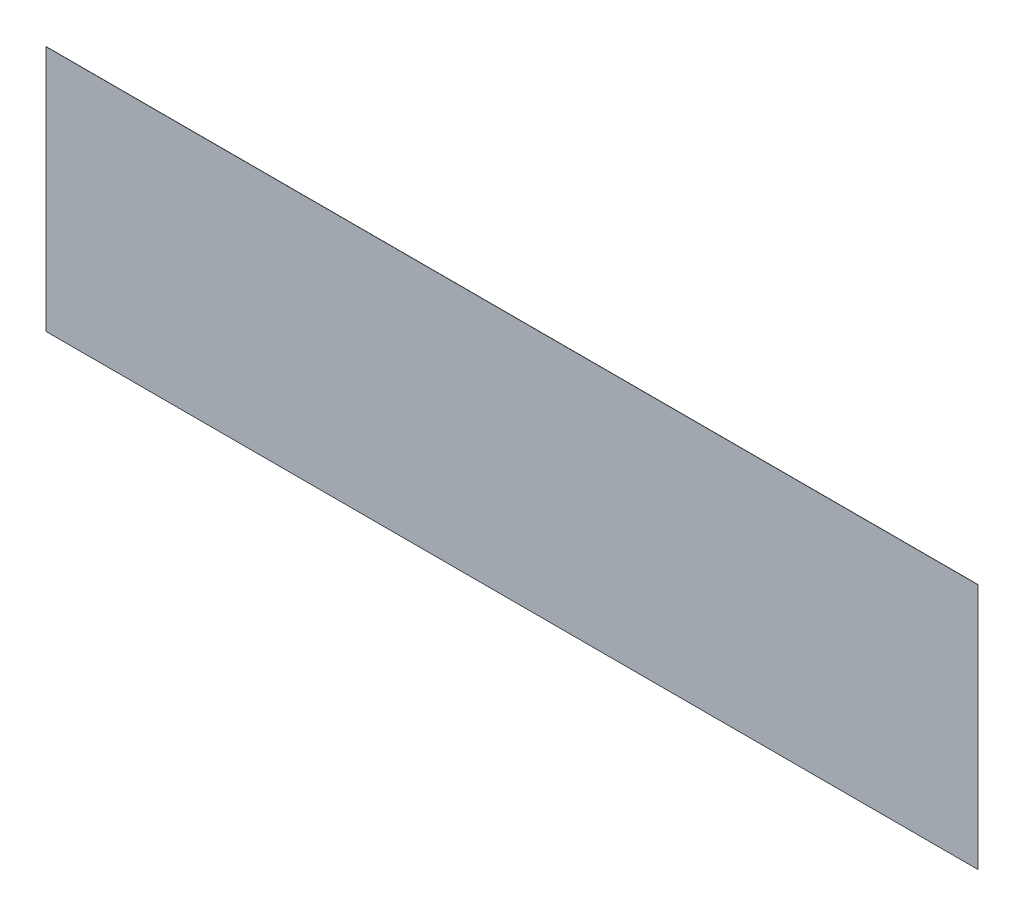
ISO-10303-21;
HEADER;
FILE_DESCRIPTION(('STEP AP214'),'2;1');
FILE_NAME('part.step','',(''),(''),'','','');
FILE_SCHEMA(('AUTOMOTIVE_DESIGN { 1 0 10303 214 1 1 1 1 }'));
ENDSEC;
DATA;
#1=APPLICATION_CONTEXT('core data for automotive mechanical design processes');
#2=APPLICATION_PROTOCOL_DEFINITION('international standard','automotive_design',2000,#1);
#3=PRODUCT_CONTEXT('',#1,'mechanical');
#4=PRODUCT('Part','Part','',(#3));
#5=PRODUCT_RELATED_PRODUCT_CATEGORY('part','',(#4));
#6=PRODUCT_DEFINITION_FORMATION('','',#4);
#7=PRODUCT_DEFINITION_CONTEXT('part definition',#1,'design');
#8=PRODUCT_DEFINITION('design','',#6,#7);
#9=PRODUCT_DEFINITION_SHAPE('','',#8);
#10=(LENGTH_UNIT() NAMED_UNIT(*) SI_UNIT(.MILLI.,.METRE.));
#11=(NAMED_UNIT(*) PLANE_ANGLE_UNIT() SI_UNIT($,.RADIAN.));
#12=(NAMED_UNIT(*) SI_UNIT($,.STERADIAN.) SOLID_ANGLE_UNIT());
#13=UNCERTAINTY_MEASURE_WITH_UNIT(LENGTH_MEASURE(1.E-05),#10,'distance_accuracy_value','');
#14=(GEOMETRIC_REPRESENTATION_CONTEXT(3) GLOBAL_UNCERTAINTY_ASSIGNED_CONTEXT((#13)) GLOBAL_UNIT_ASSIGNED_CONTEXT((#10,
#11,#12)) REPRESENTATION_CONTEXT('',''));
#15=CARTESIAN_POINT('',(0.,0.,0.));
#16=DIRECTION('',(0.,0.,1.));
#17=DIRECTION('',(1.,0.,0.));
#18=AXIS2_PLACEMENT_3D('',#15,#16,#17);
#19=CARTESIAN_POINT('',(0.,0.,-10.));
#20=DIRECTION('',(-1.,0.,0.));
#21=DIRECTION('',(0.,0.,1.));
#22=AXIS2_PLACEMENT_3D('',#19,#20,#21);
#23=PLANE('',#22);
#24=DIRECTION('',(0.,-1.,0.));
#25=VECTOR('',#24,1.);
#26=CARTESIAN_POINT('',(0.,0.,0.));
#27=LINE('',#26,#25);
#28=CARTESIAN_POINT('',(0.,12681.5,0.));
#29=VERTEX_POINT('',#28);
#30=CARTESIAN_POINT('',(0.,0.,0.));
#31=VERTEX_POINT('',#30);
#32=EDGE_CURVE('E97',#29,#31,#27,.T.);
#33=ORIENTED_EDGE('',*,*,#32,.F.);
#34=DIRECTION('',(0.,0.,1.));
#35=VECTOR('',#34,1.);
#36=CARTESIAN_POINT('',(0.,12681.5,-10.));
#37=LINE('',#36,#35);
#38=CARTESIAN_POINT('',(0.,12681.5,-10.));
#39=VERTEX_POINT('',#38);
#40=EDGE_CURVE('E11',#39,#29,#37,.T.);
#41=ORIENTED_EDGE('',*,*,#40,.F.);
#42=DIRECTION('',(0.,-1.,0.));
#43=VECTOR('',#42,1.);
#44=CARTESIAN_POINT('',(0.,0.,-10.));
#45=LINE('',#44,#43);
#46=CARTESIAN_POINT('',(0.,0.,-10.));
#47=VERTEX_POINT('',#46);
#48=EDGE_CURVE('E91',#39,#47,#45,.T.);
#49=ORIENTED_EDGE('',*,*,#48,.T.);
#50=DIRECTION('',(0.,0.,1.));
#51=VECTOR('',#50,1.);
#52=CARTESIAN_POINT('',(0.,0.,-10.));
#53=LINE('',#52,#51);
#54=EDGE_CURVE('E36',#47,#31,#53,.T.);
#55=ORIENTED_EDGE('',*,*,#54,.T.);
#56=EDGE_LOOP('',(#33,#41,#49,#55));
#57=FACE_BOUND('',#56,.T.);
#58=ADVANCED_FACE('F33',(#57),#23,.T.);
#59=CARTESIAN_POINT('',(0.,12681.5,-10.));
#60=DIRECTION('',(0.,1.,0.));
#61=DIRECTION('',(0.,0.,1.));
#62=AXIS2_PLACEMENT_3D('',#59,#60,#61);
#63=PLANE('',#62);
#64=DIRECTION('',(-1.,0.,0.));
#65=VECTOR('',#64,1.);
#66=CARTESIAN_POINT('',(0.,12681.5,0.));
#67=LINE('',#66,#65);
#68=CARTESIAN_POINT('',(47916.,12681.5,0.));
#69=VERTEX_POINT('',#68);
#70=EDGE_CURVE('E93',#69,#29,#67,.T.);
#71=ORIENTED_EDGE('',*,*,#70,.F.);
#72=DIRECTION('',(0.,0.,1.));
#73=VECTOR('',#72,1.);
#74=CARTESIAN_POINT('',(47916.,12681.5,-10.));
#75=LINE('',#74,#73);
#76=CARTESIAN_POINT('',(47916.,12681.5,-10.));
#77=VERTEX_POINT('',#76);
#78=EDGE_CURVE('E42',#77,#69,#75,.T.);
#79=ORIENTED_EDGE('',*,*,#78,.F.);
#80=DIRECTION('',(-1.,0.,0.));
#81=VECTOR('',#80,1.);
#82=CARTESIAN_POINT('',(0.,12681.5,-10.));
#83=LINE('',#82,#81);
#84=EDGE_CURVE('E88',#77,#39,#83,.T.);
#85=ORIENTED_EDGE('',*,*,#84,.T.);
#86=ORIENTED_EDGE('',*,*,#40,.T.);
#87=EDGE_LOOP('',(#71,#79,#85,#86));
#88=FACE_BOUND('',#87,.T.);
#89=ADVANCED_FACE('F107',(#88),#63,.T.);
#90=CARTESIAN_POINT('',(47916.,0.,-10.));
#91=DIRECTION('',(1.,0.,0.));
#92=DIRECTION('',(0.,0.,-1.));
#93=AXIS2_PLACEMENT_3D('',#90,#91,#92);
#94=PLANE('',#93);
#95=DIRECTION('',(0.,1.,0.));
#96=VECTOR('',#95,1.);
#97=CARTESIAN_POINT('',(47916.,0.,0.));
#98=LINE('',#97,#96);
#99=CARTESIAN_POINT('',(47916.,0.,0.));
#100=VERTEX_POINT('',#99);
#101=EDGE_CURVE('E83',#100,#69,#98,.T.);
#102=ORIENTED_EDGE('',*,*,#101,.F.);
#103=DIRECTION('',(0.,0.,1.));
#104=VECTOR('',#103,1.);
#105=CARTESIAN_POINT('',(47916.,0.,-10.));
#106=LINE('',#105,#104);
#107=CARTESIAN_POINT('',(47916.,0.,-10.));
#108=VERTEX_POINT('',#107);
#109=EDGE_CURVE('E78',#108,#100,#106,.T.);
#110=ORIENTED_EDGE('',*,*,#109,.F.);
#111=DIRECTION('',(0.,1.,0.));
#112=VECTOR('',#111,1.);
#113=CARTESIAN_POINT('',(47916.,0.,-10.));
#114=LINE('',#113,#112);
#115=EDGE_CURVE('E81',#108,#77,#114,.T.);
#116=ORIENTED_EDGE('',*,*,#115,.T.);
#117=ORIENTED_EDGE('',*,*,#78,.T.);
#118=EDGE_LOOP('',(#102,#110,#116,#117));
#119=FACE_BOUND('',#118,.T.);
#120=ADVANCED_FACE('F80',(#119),#94,.T.);
#121=CARTESIAN_POINT('',(0.,0.,-10.));
#122=DIRECTION('',(0.,-1.,0.));
#123=DIRECTION('',(0.,0.,-1.));
#124=AXIS2_PLACEMENT_3D('',#121,#122,#123);
#125=PLANE('',#124);
#126=DIRECTION('',(1.,0.,0.));
#127=VECTOR('',#126,1.);
#128=CARTESIAN_POINT('',(0.,0.,0.));
#129=LINE('',#128,#127);
#130=EDGE_CURVE('E100',#31,#100,#129,.T.);
#131=ORIENTED_EDGE('',*,*,#130,.F.);
#132=ORIENTED_EDGE('',*,*,#54,.F.);
#133=DIRECTION('',(1.,0.,0.));
#134=VECTOR('',#133,1.);
#135=CARTESIAN_POINT('',(0.,0.,-10.));
#136=LINE('',#135,#134);
#137=EDGE_CURVE('E87',#47,#108,#136,.T.);
#138=ORIENTED_EDGE('',*,*,#137,.T.);
#139=ORIENTED_EDGE('',*,*,#109,.T.);
#140=EDGE_LOOP('',(#131,#132,#138,#139));
#141=FACE_BOUND('',#140,.T.);
#142=ADVANCED_FACE('F90',(#141),#125,.T.);
#143=CARTESIAN_POINT('',(0.,12681.5,-10.));
#144=DIRECTION('',(0.,0.,-1.));
#145=DIRECTION('',(-1.,0.,0.));
#146=AXIS2_PLACEMENT_3D('',#143,#144,#145);
#147=PLANE('',#146);
#148=ORIENTED_EDGE('',*,*,#48,.F.);
#149=ORIENTED_EDGE('',*,*,#84,.F.);
#150=ORIENTED_EDGE('',*,*,#115,.F.);
#151=ORIENTED_EDGE('',*,*,#137,.F.);
#152=EDGE_LOOP('',(#148,#149,#150,#151));
#153=FACE_BOUND('',#152,.T.);
#154=ADVANCED_FACE('F86',(#153),#147,.T.);
#155=CARTESIAN_POINT('',(0.,12681.5,0.));
#156=DIRECTION('',(0.,0.,-1.));
#157=DIRECTION('',(-1.,0.,0.));
#158=AXIS2_PLACEMENT_3D('',#155,#156,#157);
#159=PLANE('',#158);
#160=ORIENTED_EDGE('',*,*,#32,.T.);
#161=ORIENTED_EDGE('',*,*,#130,.T.);
#162=ORIENTED_EDGE('',*,*,#101,.T.);
#163=ORIENTED_EDGE('',*,*,#70,.T.);
#164=EDGE_LOOP('',(#160,#161,#162,#163));
#165=FACE_BOUND('',#164,.T.);
#166=ADVANCED_FACE('F106',(#165),#159,.F.);
#167=CLOSED_SHELL('',(#58,#89,#120,#142,#154,#166));
#168=MANIFOLD_SOLID_BREP('B2',#167);
#169=ADVANCED_BREP_SHAPE_REPRESENTATION('',(#18,#168),#14);
#170=SHAPE_DEFINITION_REPRESENTATION(#9,#169);
ENDSEC;
END-ISO-10303-21;
